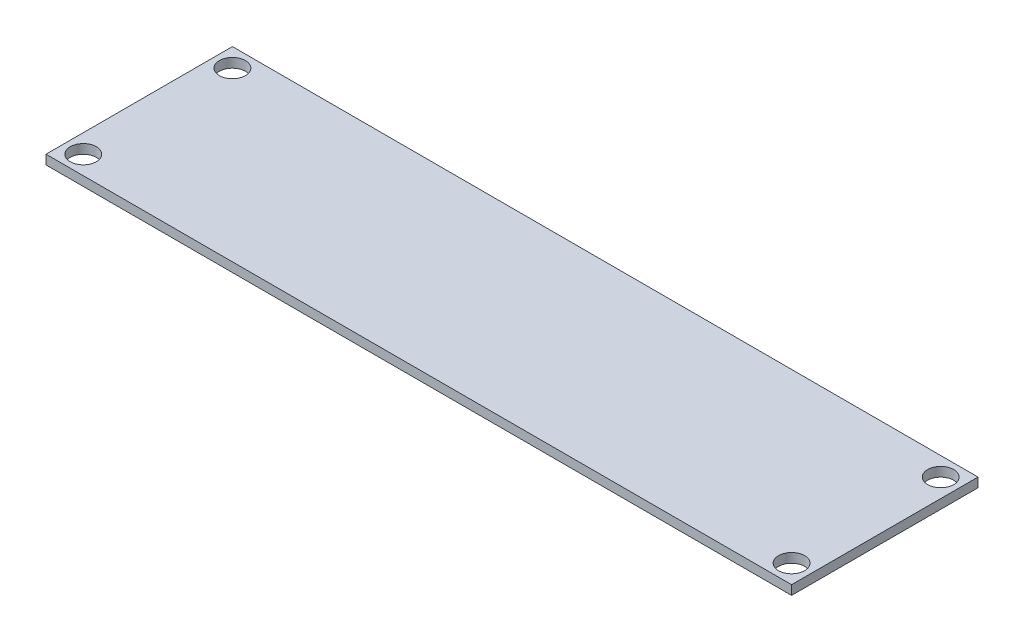
ISO-10303-21;
HEADER;
FILE_DESCRIPTION(('STEP AP214'),'2;1');
FILE_NAME('part.step','',(''),(''),'','','');
FILE_SCHEMA(('AUTOMOTIVE_DESIGN { 1 0 10303 214 1 1 1 1 }'));
ENDSEC;
DATA;
#1=APPLICATION_CONTEXT('core data for automotive mechanical design processes');
#2=APPLICATION_PROTOCOL_DEFINITION('international standard','automotive_design',2000,#1);
#3=PRODUCT_CONTEXT('',#1,'mechanical');
#4=PRODUCT('Part','Part','',(#3));
#5=PRODUCT_RELATED_PRODUCT_CATEGORY('part','',(#4));
#6=PRODUCT_DEFINITION_FORMATION('','',#4);
#7=PRODUCT_DEFINITION_CONTEXT('part definition',#1,'design');
#8=PRODUCT_DEFINITION('design','',#6,#7);
#9=PRODUCT_DEFINITION_SHAPE('','',#8);
#10=(LENGTH_UNIT() NAMED_UNIT(*) SI_UNIT(.MILLI.,.METRE.));
#11=(NAMED_UNIT(*) PLANE_ANGLE_UNIT() SI_UNIT($,.RADIAN.));
#12=(NAMED_UNIT(*) SI_UNIT($,.STERADIAN.) SOLID_ANGLE_UNIT());
#13=UNCERTAINTY_MEASURE_WITH_UNIT(LENGTH_MEASURE(1.E-05),#10,'distance_accuracy_value','');
#14=(GEOMETRIC_REPRESENTATION_CONTEXT(3) GLOBAL_UNCERTAINTY_ASSIGNED_CONTEXT((#13)) GLOBAL_UNIT_ASSIGNED_CONTEXT((#10,
#11,#12)) REPRESENTATION_CONTEXT('',''));
#15=CARTESIAN_POINT('',(0.,0.,0.));
#16=DIRECTION('',(0.,0.,1.));
#17=DIRECTION('',(1.,0.,0.));
#18=AXIS2_PLACEMENT_3D('',#15,#16,#17);
#19=CARTESIAN_POINT('',(0.,1.,0.));
#20=DIRECTION('',(1.,0.,0.));
#21=DIRECTION('',(0.,0.,-1.));
#22=AXIS2_PLACEMENT_3D('',#19,#20,#21);
#23=PLANE('',#22);
#24=DIRECTION('',(0.,0.,1.));
#25=VECTOR('',#24,1.);
#26=CARTESIAN_POINT('',(0.,0.,0.));
#27=LINE('',#26,#25);
#28=CARTESIAN_POINT('',(0.,0.,-20.));
#29=VERTEX_POINT('',#28);
#30=CARTESIAN_POINT('',(0.,0.,0.));
#31=VERTEX_POINT('',#30);
#32=EDGE_CURVE('E96',#29,#31,#27,.T.);
#33=ORIENTED_EDGE('',*,*,#32,.T.);
#34=DIRECTION('',(0.,-1.,0.));
#35=VECTOR('',#34,1.);
#36=CARTESIAN_POINT('',(0.,1.,0.));
#37=LINE('',#36,#35);
#38=CARTESIAN_POINT('',(0.,1.,0.));
#39=VERTEX_POINT('',#38);
#40=EDGE_CURVE('E11',#39,#31,#37,.T.);
#41=ORIENTED_EDGE('',*,*,#40,.F.);
#42=DIRECTION('',(0.,0.,1.));
#43=VECTOR('',#42,1.);
#44=CARTESIAN_POINT('',(0.,1.,0.));
#45=LINE('',#44,#43);
#46=CARTESIAN_POINT('',(0.,1.,-20.));
#47=VERTEX_POINT('',#46);
#48=EDGE_CURVE('E84',#47,#39,#45,.T.);
#49=ORIENTED_EDGE('',*,*,#48,.F.);
#50=DIRECTION('',(0.,-1.,0.));
#51=VECTOR('',#50,1.);
#52=CARTESIAN_POINT('',(0.,1.,-20.));
#53=LINE('',#52,#51);
#54=EDGE_CURVE('E92',#47,#29,#53,.T.);
#55=ORIENTED_EDGE('',*,*,#54,.T.);
#56=EDGE_LOOP('',(#33,#41,#49,#55));
#57=FACE_BOUND('',#56,.T.);
#58=ADVANCED_FACE('F33',(#57),#23,.F.);
#59=CARTESIAN_POINT('',(0.,1.,0.));
#60=DIRECTION('',(0.,0.,-1.));
#61=DIRECTION('',(-1.,0.,0.));
#62=AXIS2_PLACEMENT_3D('',#59,#60,#61);
#63=PLANE('',#62);
#64=DIRECTION('',(1.,0.,0.));
#65=VECTOR('',#64,1.);
#66=CARTESIAN_POINT('',(0.,0.,0.));
#67=LINE('',#66,#65);
#68=CARTESIAN_POINT('',(80.,0.,0.));
#69=VERTEX_POINT('',#68);
#70=EDGE_CURVE('E88',#31,#69,#67,.T.);
#71=ORIENTED_EDGE('',*,*,#70,.T.);
#72=DIRECTION('',(0.,-1.,0.));
#73=VECTOR('',#72,1.);
#74=CARTESIAN_POINT('',(80.,1.,0.));
#75=LINE('',#74,#73);
#76=CARTESIAN_POINT('',(80.,1.,0.));
#77=VERTEX_POINT('',#76);
#78=EDGE_CURVE('E41',#77,#69,#75,.T.);
#79=ORIENTED_EDGE('',*,*,#78,.F.);
#80=DIRECTION('',(1.,0.,0.));
#81=VECTOR('',#80,1.);
#82=CARTESIAN_POINT('',(0.,1.,0.));
#83=LINE('',#82,#81);
#84=EDGE_CURVE('E79',#39,#77,#83,.T.);
#85=ORIENTED_EDGE('',*,*,#84,.F.);
#86=ORIENTED_EDGE('',*,*,#40,.T.);
#87=EDGE_LOOP('',(#71,#79,#85,#86));
#88=FACE_BOUND('',#87,.T.);
#89=ADVANCED_FACE('F87',(#88),#63,.F.);
#90=CARTESIAN_POINT('',(80.,1.,0.));
#91=DIRECTION('',(-1.,0.,0.));
#92=DIRECTION('',(0.,0.,1.));
#93=AXIS2_PLACEMENT_3D('',#90,#91,#92);
#94=PLANE('',#93);
#95=DIRECTION('',(0.,0.,-1.));
#96=VECTOR('',#95,1.);
#97=CARTESIAN_POINT('',(80.,0.,0.));
#98=LINE('',#97,#96);
#99=CARTESIAN_POINT('',(80.,0.,-20.));
#100=VERTEX_POINT('',#99);
#101=EDGE_CURVE('E66',#69,#100,#98,.T.);
#102=ORIENTED_EDGE('',*,*,#101,.T.);
#103=DIRECTION('',(0.,-1.,0.));
#104=VECTOR('',#103,1.);
#105=CARTESIAN_POINT('',(80.,1.,-20.));
#106=LINE('',#105,#104);
#107=CARTESIAN_POINT('',(80.,1.,-20.));
#108=VERTEX_POINT('',#107);
#109=EDGE_CURVE('E89',#108,#100,#106,.T.);
#110=ORIENTED_EDGE('',*,*,#109,.F.);
#111=DIRECTION('',(0.,0.,-1.));
#112=VECTOR('',#111,1.);
#113=CARTESIAN_POINT('',(80.,1.,0.));
#114=LINE('',#113,#112);
#115=EDGE_CURVE('E82',#77,#108,#114,.T.);
#116=ORIENTED_EDGE('',*,*,#115,.F.);
#117=ORIENTED_EDGE('',*,*,#78,.T.);
#118=EDGE_LOOP('',(#102,#110,#116,#117));
#119=FACE_BOUND('',#118,.T.);
#120=ADVANCED_FACE('F90',(#119),#94,.F.);
#121=CARTESIAN_POINT('',(0.,1.,-20.));
#122=DIRECTION('',(0.,0.,1.));
#123=DIRECTION('',(1.,0.,0.));
#124=AXIS2_PLACEMENT_3D('',#121,#122,#123);
#125=PLANE('',#124);
#126=DIRECTION('',(-1.,0.,0.));
#127=VECTOR('',#126,1.);
#128=CARTESIAN_POINT('',(0.,0.,-20.));
#129=LINE('',#128,#127);
#130=EDGE_CURVE('E72',#100,#29,#129,.T.);
#131=ORIENTED_EDGE('',*,*,#130,.T.);
#132=ORIENTED_EDGE('',*,*,#54,.F.);
#133=DIRECTION('',(-1.,0.,0.));
#134=VECTOR('',#133,1.);
#135=CARTESIAN_POINT('',(0.,1.,-20.));
#136=LINE('',#135,#134);
#137=EDGE_CURVE('E49',#108,#47,#136,.T.);
#138=ORIENTED_EDGE('',*,*,#137,.F.);
#139=ORIENTED_EDGE('',*,*,#109,.T.);
#140=EDGE_LOOP('',(#131,#132,#138,#139));
#141=FACE_BOUND('',#140,.T.);
#142=ADVANCED_FACE('F104',(#141),#125,.F.);
#143=CARTESIAN_POINT('',(0.,1.,0.));
#144=DIRECTION('',(0.,-1.,0.));
#145=DIRECTION('',(0.,0.,-1.));
#146=AXIS2_PLACEMENT_3D('',#143,#144,#145);
#147=PLANE('',#146);
#148=CARTESIAN_POINT('',(2.00000000000001,1.,-2.00000000000001));
#149=DIRECTION('',(0.,1.,0.));
#150=DIRECTION('',(0.,0.,1.));
#151=AXIS2_PLACEMENT_3D('',#148,#149,#150);
#152=CIRCLE('',#151,1.4);
#153=CARTESIAN_POINT('',(2.00000000000001,1.,-0.600000000000009));
#154=VERTEX_POINT('',#153);
#155=EDGE_CURVE('E116',#154,#154,#152,.T.);
#156=ORIENTED_EDGE('',*,*,#155,.F.);
#157=EDGE_LOOP('',(#156));
#158=FACE_BOUND('',#157,.T.);
#159=CARTESIAN_POINT('',(78.,1.,-2.00000000000001));
#160=DIRECTION('',(0.,1.,0.));
#161=DIRECTION('',(0.,0.,1.));
#162=AXIS2_PLACEMENT_3D('',#159,#160,#161);
#163=CIRCLE('',#162,1.4);
#164=CARTESIAN_POINT('',(78.,1.,-0.600000000000004));
#165=VERTEX_POINT('',#164);
#166=EDGE_CURVE('E122',#165,#165,#163,.T.);
#167=ORIENTED_EDGE('',*,*,#166,.F.);
#168=EDGE_LOOP('',(#167));
#169=FACE_BOUND('',#168,.T.);
#170=CARTESIAN_POINT('',(78.,1.,-18.));
#171=DIRECTION('',(0.,1.,0.));
#172=DIRECTION('',(0.,0.,1.));
#173=AXIS2_PLACEMENT_3D('',#170,#171,#172);
#174=CIRCLE('',#173,1.4);
#175=CARTESIAN_POINT('',(78.,1.,-16.6));
#176=VERTEX_POINT('',#175);
#177=EDGE_CURVE('E128',#176,#176,#174,.T.);
#178=ORIENTED_EDGE('',*,*,#177,.F.);
#179=EDGE_LOOP('',(#178));
#180=FACE_BOUND('',#179,.T.);
#181=CARTESIAN_POINT('',(2.,1.,-18.));
#182=DIRECTION('',(0.,1.,0.));
#183=DIRECTION('',(0.,0.,1.));
#184=AXIS2_PLACEMENT_3D('',#181,#182,#183);
#185=CIRCLE('',#184,1.4);
#186=CARTESIAN_POINT('',(2.,1.,-16.6));
#187=VERTEX_POINT('',#186);
#188=EDGE_CURVE('E110',#187,#187,#185,.T.);
#189=ORIENTED_EDGE('',*,*,#188,.F.);
#190=EDGE_LOOP('',(#189));
#191=FACE_BOUND('',#190,.T.);
#192=ORIENTED_EDGE('',*,*,#48,.T.);
#193=ORIENTED_EDGE('',*,*,#84,.T.);
#194=ORIENTED_EDGE('',*,*,#115,.T.);
#195=ORIENTED_EDGE('',*,*,#137,.T.);
#196=EDGE_LOOP('',(#192,#193,#194,#195));
#197=FACE_BOUND('',#196,.T.);
#198=ADVANCED_FACE('F80',(#158,#169,#180,#191,#197),#147,.F.);
#199=CARTESIAN_POINT('',(0.,0.,0.));
#200=DIRECTION('',(0.,-1.,0.));
#201=DIRECTION('',(0.,0.,-1.));
#202=AXIS2_PLACEMENT_3D('',#199,#200,#201);
#203=PLANE('',#202);
#204=CARTESIAN_POINT('',(2.00000000000001,0.,-2.00000000000001));
#205=DIRECTION('',(0.,1.,0.));
#206=DIRECTION('',(0.,0.,1.));
#207=AXIS2_PLACEMENT_3D('',#204,#205,#206);
#208=CIRCLE('',#207,1.4);
#209=CARTESIAN_POINT('',(2.00000000000001,0.,-0.600000000000009));
#210=VERTEX_POINT('',#209);
#211=EDGE_CURVE('E119',#210,#210,#208,.T.);
#212=ORIENTED_EDGE('',*,*,#211,.T.);
#213=EDGE_LOOP('',(#212));
#214=FACE_BOUND('',#213,.T.);
#215=CARTESIAN_POINT('',(78.,0.,-2.00000000000001));
#216=DIRECTION('',(0.,1.,0.));
#217=DIRECTION('',(0.,0.,1.));
#218=AXIS2_PLACEMENT_3D('',#215,#216,#217);
#219=CIRCLE('',#218,1.4);
#220=CARTESIAN_POINT('',(78.,0.,-0.600000000000004));
#221=VERTEX_POINT('',#220);
#222=EDGE_CURVE('E125',#221,#221,#219,.T.);
#223=ORIENTED_EDGE('',*,*,#222,.T.);
#224=EDGE_LOOP('',(#223));
#225=FACE_BOUND('',#224,.T.);
#226=CARTESIAN_POINT('',(78.,0.,-18.));
#227=DIRECTION('',(0.,1.,0.));
#228=DIRECTION('',(0.,0.,1.));
#229=AXIS2_PLACEMENT_3D('',#226,#227,#228);
#230=CIRCLE('',#229,1.4);
#231=CARTESIAN_POINT('',(78.,0.,-16.6));
#232=VERTEX_POINT('',#231);
#233=EDGE_CURVE('E113',#232,#232,#230,.T.);
#234=ORIENTED_EDGE('',*,*,#233,.T.);
#235=EDGE_LOOP('',(#234));
#236=FACE_BOUND('',#235,.T.);
#237=CARTESIAN_POINT('',(2.,0.,-18.));
#238=DIRECTION('',(0.,1.,0.));
#239=DIRECTION('',(0.,0.,1.));
#240=AXIS2_PLACEMENT_3D('',#237,#238,#239);
#241=CIRCLE('',#240,1.4);
#242=CARTESIAN_POINT('',(2.,0.,-16.6));
#243=VERTEX_POINT('',#242);
#244=EDGE_CURVE('E99',#243,#243,#241,.T.);
#245=ORIENTED_EDGE('',*,*,#244,.T.);
#246=EDGE_LOOP('',(#245));
#247=FACE_BOUND('',#246,.T.);
#248=ORIENTED_EDGE('',*,*,#32,.F.);
#249=ORIENTED_EDGE('',*,*,#130,.F.);
#250=ORIENTED_EDGE('',*,*,#101,.F.);
#251=ORIENTED_EDGE('',*,*,#70,.F.);
#252=EDGE_LOOP('',(#248,#249,#250,#251));
#253=FACE_BOUND('',#252,.T.);
#254=ADVANCED_FACE('F107',(#214,#225,#236,#247,#253),#203,.T.);
#255=CARTESIAN_POINT('',(2.,0.,-18.));
#256=DIRECTION('',(0.,1.,0.));
#257=DIRECTION('',(0.,0.,1.));
#258=AXIS2_PLACEMENT_3D('',#255,#256,#257);
#259=CYLINDRICAL_SURFACE('',#258,1.4);
#260=ORIENTED_EDGE('',*,*,#244,.F.);
#261=EDGE_LOOP('',(#260));
#262=FACE_BOUND('',#261,.T.);
#263=ORIENTED_EDGE('',*,*,#188,.T.);
#264=EDGE_LOOP('',(#263));
#265=FACE_BOUND('',#264,.T.);
#266=ADVANCED_FACE('F140',(#262,#265),#259,.F.);
#267=CARTESIAN_POINT('',(78.,0.,-18.));
#268=DIRECTION('',(0.,1.,0.));
#269=DIRECTION('',(0.,0.,1.));
#270=AXIS2_PLACEMENT_3D('',#267,#268,#269);
#271=CYLINDRICAL_SURFACE('',#270,1.4);
#272=ORIENTED_EDGE('',*,*,#233,.F.);
#273=EDGE_LOOP('',(#272));
#274=FACE_BOUND('',#273,.T.);
#275=ORIENTED_EDGE('',*,*,#177,.T.);
#276=EDGE_LOOP('',(#275));
#277=FACE_BOUND('',#276,.T.);
#278=ADVANCED_FACE('F136',(#274,#277),#271,.F.);
#279=CARTESIAN_POINT('',(78.,0.,-2.00000000000001));
#280=DIRECTION('',(0.,1.,0.));
#281=DIRECTION('',(0.,0.,1.));
#282=AXIS2_PLACEMENT_3D('',#279,#280,#281);
#283=CYLINDRICAL_SURFACE('',#282,1.4);
#284=ORIENTED_EDGE('',*,*,#222,.F.);
#285=EDGE_LOOP('',(#284));
#286=FACE_BOUND('',#285,.T.);
#287=ORIENTED_EDGE('',*,*,#166,.T.);
#288=EDGE_LOOP('',(#287));
#289=FACE_BOUND('',#288,.T.);
#290=ADVANCED_FACE('F139',(#286,#289),#283,.F.);
#291=CARTESIAN_POINT('',(2.00000000000001,0.,-2.00000000000001));
#292=DIRECTION('',(0.,1.,0.));
#293=DIRECTION('',(0.,0.,1.));
#294=AXIS2_PLACEMENT_3D('',#291,#292,#293);
#295=CYLINDRICAL_SURFACE('',#294,1.4);
#296=ORIENTED_EDGE('',*,*,#211,.F.);
#297=EDGE_LOOP('',(#296));
#298=FACE_BOUND('',#297,.T.);
#299=ORIENTED_EDGE('',*,*,#155,.T.);
#300=EDGE_LOOP('',(#299));
#301=FACE_BOUND('',#300,.T.);
#302=ADVANCED_FACE('F201',(#298,#301),#295,.F.);
#303=CLOSED_SHELL('',(#58,#89,#120,#142,#198,#254,#266,#278,#290,#302));
#304=MANIFOLD_SOLID_BREP('B2',#303);
#305=ADVANCED_BREP_SHAPE_REPRESENTATION('',(#18,#304),#14);
#306=SHAPE_DEFINITION_REPRESENTATION(#9,#305);
ENDSEC;
END-ISO-10303-21;
